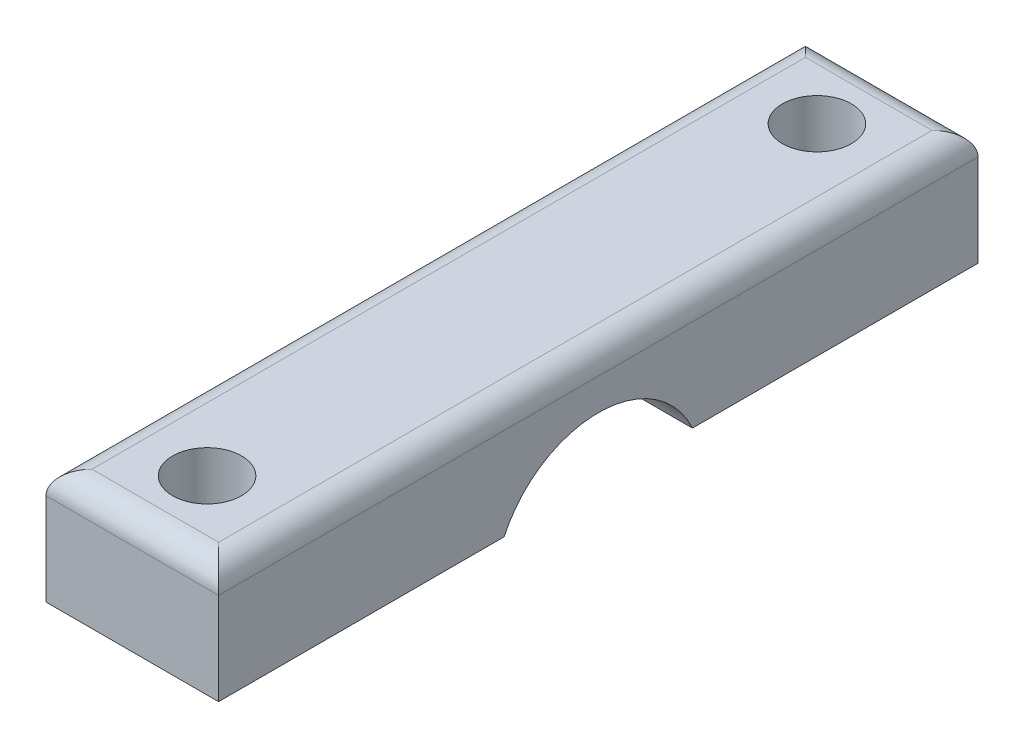
ISO-10303-21;
HEADER;
FILE_DESCRIPTION(('STEP AP214'),'2;1');
FILE_NAME('part.step','',(''),(''),'','','');
FILE_SCHEMA(('AUTOMOTIVE_DESIGN { 1 0 10303 214 1 1 1 1 }'));
ENDSEC;
DATA;
#1=APPLICATION_CONTEXT('core data for automotive mechanical design processes');
#2=APPLICATION_PROTOCOL_DEFINITION('international standard','automotive_design',2000,#1);
#3=PRODUCT_CONTEXT('',#1,'mechanical');
#4=PRODUCT('Part','Part','',(#3));
#5=PRODUCT_RELATED_PRODUCT_CATEGORY('part','',(#4));
#6=PRODUCT_DEFINITION_FORMATION('','',#4);
#7=PRODUCT_DEFINITION_CONTEXT('part definition',#1,'design');
#8=PRODUCT_DEFINITION('design','',#6,#7);
#9=PRODUCT_DEFINITION_SHAPE('','',#8);
#10=(LENGTH_UNIT() NAMED_UNIT(*) SI_UNIT(.MILLI.,.METRE.));
#11=(NAMED_UNIT(*) PLANE_ANGLE_UNIT() SI_UNIT($,.RADIAN.));
#12=(NAMED_UNIT(*) SI_UNIT($,.STERADIAN.) SOLID_ANGLE_UNIT());
#13=UNCERTAINTY_MEASURE_WITH_UNIT(LENGTH_MEASURE(1.E-05),#10,'distance_accuracy_value','');
#14=(GEOMETRIC_REPRESENTATION_CONTEXT(3) GLOBAL_UNCERTAINTY_ASSIGNED_CONTEXT((#13)) GLOBAL_UNIT_ASSIGNED_CONTEXT((#10,
#11,#12)) REPRESENTATION_CONTEXT('',''));
#15=CARTESIAN_POINT('',(0.,0.,0.));
#16=DIRECTION('',(0.,0.,1.));
#17=DIRECTION('',(1.,0.,0.));
#18=AXIS2_PLACEMENT_3D('',#15,#16,#17);
#19=CARTESIAN_POINT('',(0.,0.,0.));
#20=DIRECTION('',(0.,-1.,0.));
#21=DIRECTION('',(0.,0.,-1.));
#22=AXIS2_PLACEMENT_3D('',#19,#20,#21);
#23=PLANE('',#22);
#24=DIRECTION('',(1.,0.,0.));
#25=VECTOR('',#24,1.);
#26=CARTESIAN_POINT('',(0.,0.,-41.1815340859768));
#27=LINE('',#26,#25);
#28=CARTESIAN_POINT('',(0.,0.,-41.1815340859768));
#29=VERTEX_POINT('',#28);
#30=CARTESIAN_POINT('',(15.,0.,-41.1815340859768));
#31=VERTEX_POINT('',#30);
#32=EDGE_CURVE('E55',#29,#31,#27,.T.);
#33=ORIENTED_EDGE('',*,*,#32,.F.);
#34=DIRECTION('',(0.,0.,1.));
#35=VECTOR('',#34,1.);
#36=CARTESIAN_POINT('',(0.,0.,0.));
#37=LINE('',#36,#35);
#38=CARTESIAN_POINT('',(0.,0.,-66.));
#39=VERTEX_POINT('',#38);
#40=EDGE_CURVE('E116',#39,#29,#37,.T.);
#41=ORIENTED_EDGE('',*,*,#40,.F.);
#42=DIRECTION('',(-1.,0.,0.));
#43=VECTOR('',#42,1.);
#44=CARTESIAN_POINT('',(0.,0.,-66.));
#45=LINE('',#44,#43);
#46=CARTESIAN_POINT('',(15.,0.,-66.));
#47=VERTEX_POINT('',#46);
#48=EDGE_CURVE('E136',#47,#39,#45,.T.);
#49=ORIENTED_EDGE('',*,*,#48,.F.);
#50=DIRECTION('',(0.,0.,-1.));
#51=VECTOR('',#50,1.);
#52=CARTESIAN_POINT('',(15.,0.,0.));
#53=LINE('',#52,#51);
#54=EDGE_CURVE('E117',#31,#47,#53,.T.);
#55=ORIENTED_EDGE('',*,*,#54,.F.);
#56=EDGE_LOOP('',(#33,#41,#49,#55));
#57=FACE_BOUND('',#56,.T.);
#58=CARTESIAN_POINT('',(7.5,0.,-59.5));
#59=DIRECTION('',(0.,1.,0.));
#60=DIRECTION('',(0.,0.,1.));
#61=AXIS2_PLACEMENT_3D('',#58,#59,#60);
#62=CIRCLE('',#61,1.75);
#63=CARTESIAN_POINT('',(7.5,0.,-57.75));
#64=VERTEX_POINT('',#63);
#65=EDGE_CURVE('E129',#64,#64,#62,.T.);
#66=ORIENTED_EDGE('',*,*,#65,.T.);
#67=EDGE_LOOP('',(#66));
#68=FACE_BOUND('',#67,.T.);
#69=ADVANCED_FACE('F38',(#57,#68),#23,.T.);
#70=CARTESIAN_POINT('',(7.5,10.,-59.5));
#71=DIRECTION('',(0.,-1.,0.));
#72=DIRECTION('',(0.,0.,-1.));
#73=AXIS2_PLACEMENT_3D('',#70,#71,#72);
#74=CYLINDRICAL_SURFACE('',#73,1.75);
#75=ORIENTED_EDGE('',*,*,#65,.F.);
#76=EDGE_LOOP('',(#75));
#77=FACE_BOUND('',#76,.T.);
#78=CARTESIAN_POINT('',(7.5,4.,-59.5));
#79=DIRECTION('',(0.,1.,0.));
#80=DIRECTION('',(0.,0.,1.));
#81=AXIS2_PLACEMENT_3D('',#78,#79,#80);
#82=CIRCLE('',#81,1.75);
#83=CARTESIAN_POINT('',(7.5,4.,-57.75));
#84=VERTEX_POINT('',#83);
#85=EDGE_CURVE('E151',#84,#84,#82,.T.);
#86=ORIENTED_EDGE('',*,*,#85,.T.);
#87=EDGE_LOOP('',(#86));
#88=FACE_BOUND('',#87,.T.);
#89=ADVANCED_FACE('F198',(#77,#88),#74,.F.);
#90=CARTESIAN_POINT('',(7.5,10.,-6.5));
#91=DIRECTION('',(0.,-1.,0.));
#92=DIRECTION('',(0.,0.,-1.));
#93=AXIS2_PLACEMENT_3D('',#90,#91,#92);
#94=CYLINDRICAL_SURFACE('',#93,1.75);
#95=CARTESIAN_POINT('',(7.5,0.,-6.5));
#96=DIRECTION('',(0.,1.,0.));
#97=DIRECTION('',(0.,0.,1.));
#98=AXIS2_PLACEMENT_3D('',#95,#96,#97);
#99=CIRCLE('',#98,1.75);
#100=CARTESIAN_POINT('',(7.5,0.,-4.75));
#101=VERTEX_POINT('',#100);
#102=EDGE_CURVE('E155',#101,#101,#99,.T.);
#103=ORIENTED_EDGE('',*,*,#102,.F.);
#104=EDGE_LOOP('',(#103));
#105=FACE_BOUND('',#104,.T.);
#106=CARTESIAN_POINT('',(7.5,4.,-6.5));
#107=DIRECTION('',(0.,1.,0.));
#108=DIRECTION('',(0.,0.,1.));
#109=AXIS2_PLACEMENT_3D('',#106,#107,#108);
#110=CIRCLE('',#109,1.75);
#111=CARTESIAN_POINT('',(7.5,4.,-4.75));
#112=VERTEX_POINT('',#111);
#113=EDGE_CURVE('E148',#112,#112,#110,.T.);
#114=ORIENTED_EDGE('',*,*,#113,.T.);
#115=EDGE_LOOP('',(#114));
#116=FACE_BOUND('',#115,.T.);
#117=ADVANCED_FACE('F201',(#105,#116),#94,.F.);
#118=CARTESIAN_POINT('',(0.,10.,0.));
#119=DIRECTION('',(0.,-1.,0.));
#120=DIRECTION('',(0.,0.,-1.));
#121=AXIS2_PLACEMENT_3D('',#118,#119,#120);
#122=PLANE('',#121);
#123=DIRECTION('',(0.,0.,-1.));
#124=VECTOR('',#123,1.);
#125=CARTESIAN_POINT('',(13.,10.,0.));
#126=LINE('',#125,#124);
#127=CARTESIAN_POINT('',(13.,10.,-2.));
#128=VERTEX_POINT('',#127);
#129=CARTESIAN_POINT('',(13.,10.,-64.));
#130=VERTEX_POINT('',#129);
#131=EDGE_CURVE('E147',#128,#130,#126,.T.);
#132=ORIENTED_EDGE('',*,*,#131,.T.);
#133=DIRECTION('',(-1.,0.,0.));
#134=VECTOR('',#133,1.);
#135=CARTESIAN_POINT('',(0.,10.,-64.));
#136=LINE('',#135,#134);
#137=CARTESIAN_POINT('',(2.,10.,-64.));
#138=VERTEX_POINT('',#137);
#139=EDGE_CURVE('E161',#130,#138,#136,.T.);
#140=ORIENTED_EDGE('',*,*,#139,.T.);
#141=DIRECTION('',(0.,0.,1.));
#142=VECTOR('',#141,1.);
#143=CARTESIAN_POINT('',(2.,10.,0.));
#144=LINE('',#143,#142);
#145=CARTESIAN_POINT('',(2.,10.,-2.));
#146=VERTEX_POINT('',#145);
#147=EDGE_CURVE('E159',#138,#146,#144,.T.);
#148=ORIENTED_EDGE('',*,*,#147,.T.);
#149=DIRECTION('',(1.,0.,0.));
#150=VECTOR('',#149,1.);
#151=CARTESIAN_POINT('',(0.,10.,-2.));
#152=LINE('',#151,#150);
#153=EDGE_CURVE('E157',#146,#128,#152,.T.);
#154=ORIENTED_EDGE('',*,*,#153,.T.);
#155=EDGE_LOOP('',(#132,#140,#148,#154));
#156=FACE_BOUND('',#155,.T.);
#157=CARTESIAN_POINT('',(7.5,10.,-59.5));
#158=DIRECTION('',(0.,1.,0.));
#159=DIRECTION('',(0.,0.,1.));
#160=AXIS2_PLACEMENT_3D('',#157,#158,#159);
#161=CIRCLE('',#160,3.);
#162=CARTESIAN_POINT('',(7.5,10.,-56.5));
#163=VERTEX_POINT('',#162);
#164=EDGE_CURVE('E189',#163,#163,#161,.T.);
#165=ORIENTED_EDGE('',*,*,#164,.F.);
#166=EDGE_LOOP('',(#165));
#167=FACE_BOUND('',#166,.T.);
#168=CARTESIAN_POINT('',(7.5,10.,-6.5));
#169=DIRECTION('',(0.,1.,0.));
#170=DIRECTION('',(0.,0.,1.));
#171=AXIS2_PLACEMENT_3D('',#168,#169,#170);
#172=CIRCLE('',#171,3.);
#173=CARTESIAN_POINT('',(7.5,10.,-3.5));
#174=VERTEX_POINT('',#173);
#175=EDGE_CURVE('E179',#174,#174,#172,.T.);
#176=ORIENTED_EDGE('',*,*,#175,.F.);
#177=EDGE_LOOP('',(#176));
#178=FACE_BOUND('',#177,.T.);
#179=ADVANCED_FACE('F256',(#156,#167,#178),#122,.F.);
#180=DIRECTION('',(1.,0.,0.));
#181=VECTOR('',#180,1.);
#182=CARTESIAN_POINT('',(0.,0.,-24.8184659140232));
#183=LINE('',#182,#181);
#184=CARTESIAN_POINT('',(15.,0.,-24.8184659140232));
#185=VERTEX_POINT('',#184);
#186=CARTESIAN_POINT('',(0.,0.,-24.8184659140232));
#187=VERTEX_POINT('',#186);
#188=EDGE_CURVE('E105',#185,#187,#183,.F.);
#189=ORIENTED_EDGE('',*,*,#188,.F.);
#190=CARTESIAN_POINT('',(15.,0.,0.));
#191=VERTEX_POINT('',#190);
#192=EDGE_CURVE('E133',#191,#185,#53,.T.);
#193=ORIENTED_EDGE('',*,*,#192,.F.);
#194=DIRECTION('',(1.,0.,0.));
#195=VECTOR('',#194,1.);
#196=CARTESIAN_POINT('',(0.,0.,0.));
#197=LINE('',#196,#195);
#198=CARTESIAN_POINT('',(0.,0.,0.));
#199=VERTEX_POINT('',#198);
#200=EDGE_CURVE('E124',#199,#191,#197,.T.);
#201=ORIENTED_EDGE('',*,*,#200,.F.);
#202=EDGE_CURVE('E125',#187,#199,#37,.T.);
#203=ORIENTED_EDGE('',*,*,#202,.F.);
#204=EDGE_LOOP('',(#189,#193,#201,#203));
#205=FACE_BOUND('',#204,.T.);
#206=ORIENTED_EDGE('',*,*,#102,.T.);
#207=EDGE_LOOP('',(#206));
#208=FACE_BOUND('',#207,.T.);
#209=ADVANCED_FACE('F219',(#205,#208),#23,.T.);
#210=CARTESIAN_POINT('',(0.,10.,0.));
#211=DIRECTION('',(1.,0.,0.));
#212=DIRECTION('',(0.,0.,-1.));
#213=AXIS2_PLACEMENT_3D('',#210,#211,#212);
#214=PLANE('',#213);
#215=ORIENTED_EDGE('',*,*,#40,.T.);
#216=CARTESIAN_POINT('',(0.,-3.75,-33.));
#217=DIRECTION('',(1.,0.,0.));
#218=DIRECTION('',(0.,0.,-1.));
#219=AXIS2_PLACEMENT_3D('',#216,#217,#218);
#220=CIRCLE('',#219,9.);
#221=EDGE_CURVE('E102',#29,#187,#220,.T.);
#222=ORIENTED_EDGE('',*,*,#221,.T.);
#223=ORIENTED_EDGE('',*,*,#202,.T.);
#224=DIRECTION('',(0.,-1.,0.));
#225=VECTOR('',#224,1.);
#226=CARTESIAN_POINT('',(0.,10.,0.));
#227=LINE('',#226,#225);
#228=CARTESIAN_POINT('',(0.,8.,0.));
#229=VERTEX_POINT('',#228);
#230=EDGE_CURVE('E144',#229,#199,#227,.T.);
#231=ORIENTED_EDGE('',*,*,#230,.F.);
#232=DIRECTION('',(0.,0.,1.));
#233=VECTOR('',#232,1.);
#234=CARTESIAN_POINT('',(0.,8.,0.));
#235=LINE('',#234,#233);
#236=CARTESIAN_POINT('',(0.,8.,-66.));
#237=VERTEX_POINT('',#236);
#238=EDGE_CURVE('E167',#229,#237,#235,.F.);
#239=ORIENTED_EDGE('',*,*,#238,.T.);
#240=DIRECTION('',(0.,-1.,0.));
#241=VECTOR('',#240,1.);
#242=CARTESIAN_POINT('',(0.,10.,-66.));
#243=LINE('',#242,#241);
#244=EDGE_CURVE('E122',#237,#39,#243,.T.);
#245=ORIENTED_EDGE('',*,*,#244,.T.);
#246=EDGE_LOOP('',(#215,#222,#223,#231,#239,#245));
#247=FACE_BOUND('',#246,.T.);
#248=ADVANCED_FACE('F120',(#247),#214,.F.);
#249=CARTESIAN_POINT('',(0.,10.,0.));
#250=DIRECTION('',(0.,0.,-1.));
#251=DIRECTION('',(-1.,0.,0.));
#252=AXIS2_PLACEMENT_3D('',#249,#250,#251);
#253=PLANE('',#252);
#254=DIRECTION('',(0.,-1.,0.));
#255=VECTOR('',#254,1.);
#256=CARTESIAN_POINT('',(15.,10.,0.));
#257=LINE('',#256,#255);
#258=CARTESIAN_POINT('',(15.,8.,0.));
#259=VERTEX_POINT('',#258);
#260=EDGE_CURVE('E142',#259,#191,#257,.T.);
#261=ORIENTED_EDGE('',*,*,#260,.F.);
#262=DIRECTION('',(1.,0.,0.));
#263=VECTOR('',#262,1.);
#264=CARTESIAN_POINT('',(0.,8.,0.));
#265=LINE('',#264,#263);
#266=EDGE_CURVE('E47',#259,#229,#265,.F.);
#267=ORIENTED_EDGE('',*,*,#266,.T.);
#268=ORIENTED_EDGE('',*,*,#230,.T.);
#269=ORIENTED_EDGE('',*,*,#200,.T.);
#270=EDGE_LOOP('',(#261,#267,#268,#269));
#271=FACE_BOUND('',#270,.T.);
#272=ADVANCED_FACE('F224',(#271),#253,.F.);
#273=CARTESIAN_POINT('',(15.,10.,0.));
#274=DIRECTION('',(-1.,0.,0.));
#275=DIRECTION('',(0.,0.,1.));
#276=AXIS2_PLACEMENT_3D('',#273,#274,#275);
#277=PLANE('',#276);
#278=ORIENTED_EDGE('',*,*,#192,.T.);
#279=CARTESIAN_POINT('',(15.,-3.75,-33.));
#280=DIRECTION('',(1.,0.,0.));
#281=DIRECTION('',(0.,0.,-1.));
#282=AXIS2_PLACEMENT_3D('',#279,#280,#281);
#283=CIRCLE('',#282,9.);
#284=EDGE_CURVE('E109',#31,#185,#283,.T.);
#285=ORIENTED_EDGE('',*,*,#284,.F.);
#286=ORIENTED_EDGE('',*,*,#54,.T.);
#287=DIRECTION('',(0.,-1.,0.));
#288=VECTOR('',#287,1.);
#289=CARTESIAN_POINT('',(15.,10.,-66.));
#290=LINE('',#289,#288);
#291=CARTESIAN_POINT('',(15.,8.,-66.));
#292=VERTEX_POINT('',#291);
#293=EDGE_CURVE('E139',#292,#47,#290,.T.);
#294=ORIENTED_EDGE('',*,*,#293,.F.);
#295=DIRECTION('',(0.,0.,-1.));
#296=VECTOR('',#295,1.);
#297=CARTESIAN_POINT('',(15.,8.,0.));
#298=LINE('',#297,#296);
#299=EDGE_CURVE('E11',#292,#259,#298,.F.);
#300=ORIENTED_EDGE('',*,*,#299,.T.);
#301=ORIENTED_EDGE('',*,*,#260,.T.);
#302=EDGE_LOOP('',(#278,#285,#286,#294,#300,#301));
#303=FACE_BOUND('',#302,.T.);
#304=ADVANCED_FACE('F221',(#303),#277,.F.);
#305=CARTESIAN_POINT('',(0.,10.,-66.));
#306=DIRECTION('',(0.,0.,1.));
#307=DIRECTION('',(1.,0.,0.));
#308=AXIS2_PLACEMENT_3D('',#305,#306,#307);
#309=PLANE('',#308);
#310=ORIENTED_EDGE('',*,*,#244,.F.);
#311=DIRECTION('',(-1.,0.,0.));
#312=VECTOR('',#311,1.);
#313=CARTESIAN_POINT('',(0.,8.,-66.));
#314=LINE('',#313,#312);
#315=EDGE_CURVE('E164',#237,#292,#314,.F.);
#316=ORIENTED_EDGE('',*,*,#315,.T.);
#317=ORIENTED_EDGE('',*,*,#293,.T.);
#318=ORIENTED_EDGE('',*,*,#48,.T.);
#319=EDGE_LOOP('',(#310,#316,#317,#318));
#320=FACE_BOUND('',#319,.T.);
#321=ADVANCED_FACE('F236',(#320),#309,.F.);
#322=CARTESIAN_POINT('',(7.5,4.,-6.5));
#323=DIRECTION('',(0.,1.,0.));
#324=DIRECTION('',(0.,0.,1.));
#325=AXIS2_PLACEMENT_3D('',#322,#323,#324);
#326=CYLINDRICAL_SURFACE('',#325,3.);
#327=CARTESIAN_POINT('',(7.5,4.,-6.5));
#328=DIRECTION('',(0.,1.,0.));
#329=DIRECTION('',(0.,0.,1.));
#330=AXIS2_PLACEMENT_3D('',#327,#328,#329);
#331=CIRCLE('',#330,3.);
#332=CARTESIAN_POINT('',(7.5,4.,-3.5));
#333=VERTEX_POINT('',#332);
#334=EDGE_CURVE('E184',#333,#333,#331,.T.);
#335=ORIENTED_EDGE('',*,*,#334,.F.);
#336=EDGE_LOOP('',(#335));
#337=FACE_BOUND('',#336,.T.);
#338=ORIENTED_EDGE('',*,*,#175,.T.);
#339=EDGE_LOOP('',(#338));
#340=FACE_BOUND('',#339,.T.);
#341=ADVANCED_FACE('F238',(#337,#340),#326,.F.);
#342=CARTESIAN_POINT('',(7.5,4.,-6.5));
#343=DIRECTION('',(0.,1.,0.));
#344=DIRECTION('',(0.,0.,1.));
#345=AXIS2_PLACEMENT_3D('',#342,#343,#344);
#346=PLANE('',#345);
#347=ORIENTED_EDGE('',*,*,#113,.F.);
#348=EDGE_LOOP('',(#347));
#349=FACE_BOUND('',#348,.T.);
#350=ORIENTED_EDGE('',*,*,#334,.T.);
#351=EDGE_LOOP('',(#350));
#352=FACE_BOUND('',#351,.T.);
#353=ADVANCED_FACE('F244',(#349,#352),#346,.T.);
#354=CARTESIAN_POINT('',(7.5,4.,-59.5));
#355=DIRECTION('',(0.,1.,0.));
#356=DIRECTION('',(0.,0.,1.));
#357=AXIS2_PLACEMENT_3D('',#354,#355,#356);
#358=CYLINDRICAL_SURFACE('',#357,3.);
#359=CARTESIAN_POINT('',(7.5,4.,-59.5));
#360=DIRECTION('',(0.,1.,0.));
#361=DIRECTION('',(0.,0.,1.));
#362=AXIS2_PLACEMENT_3D('',#359,#360,#361);
#363=CIRCLE('',#362,3.);
#364=CARTESIAN_POINT('',(7.5,4.,-56.5));
#365=VERTEX_POINT('',#364);
#366=EDGE_CURVE('E152',#365,#365,#363,.T.);
#367=ORIENTED_EDGE('',*,*,#366,.F.);
#368=EDGE_LOOP('',(#367));
#369=FACE_BOUND('',#368,.T.);
#370=ORIENTED_EDGE('',*,*,#164,.T.);
#371=EDGE_LOOP('',(#370));
#372=FACE_BOUND('',#371,.T.);
#373=ADVANCED_FACE('F208',(#369,#372),#358,.F.);
#374=CARTESIAN_POINT('',(7.5,4.,-59.5));
#375=DIRECTION('',(0.,1.,0.));
#376=DIRECTION('',(0.,0.,1.));
#377=AXIS2_PLACEMENT_3D('',#374,#375,#376);
#378=PLANE('',#377);
#379=ORIENTED_EDGE('',*,*,#85,.F.);
#380=EDGE_LOOP('',(#379));
#381=FACE_BOUND('',#380,.T.);
#382=ORIENTED_EDGE('',*,*,#366,.T.);
#383=EDGE_LOOP('',(#382));
#384=FACE_BOUND('',#383,.T.);
#385=ADVANCED_FACE('F205',(#381,#384),#378,.T.);
#386=CARTESIAN_POINT('',(0.,8.,-2.));
#387=DIRECTION('',(1.,0.,0.));
#388=DIRECTION('',(0.,0.,-1.));
#389=AXIS2_PLACEMENT_3D('',#386,#387,#388);
#390=CYLINDRICAL_SURFACE('',#389,2.);
#391=CARTESIAN_POINT('',(2.,8.,-2.));
#392=DIRECTION('',(0.707106781186547,0.,0.707106781186547));
#393=DIRECTION('',(0.707106781186547,0.,-0.707106781186547));
#394=AXIS2_PLACEMENT_3D('',#391,#392,#393);
#395=ELLIPSE('',#394,2.82842712474619,2.);
#396=EDGE_CURVE('E172',#229,#146,#395,.F.);
#397=ORIENTED_EDGE('',*,*,#396,.F.);
#398=ORIENTED_EDGE('',*,*,#266,.F.);
#399=CARTESIAN_POINT('',(13.,8.,-2.));
#400=DIRECTION('',(0.707106781186547,0.,-0.707106781186547));
#401=DIRECTION('',(-0.707106781186547,0.,-0.707106781186547));
#402=AXIS2_PLACEMENT_3D('',#399,#400,#401);
#403=ELLIPSE('',#402,2.82842712474619,2.);
#404=EDGE_CURVE('E42',#128,#259,#403,.T.);
#405=ORIENTED_EDGE('',*,*,#404,.F.);
#406=ORIENTED_EDGE('',*,*,#153,.F.);
#407=EDGE_LOOP('',(#397,#398,#405,#406));
#408=FACE_BOUND('',#407,.T.);
#409=ADVANCED_FACE('F40',(#408),#390,.T.);
#410=CARTESIAN_POINT('',(13.,8.,0.));
#411=DIRECTION('',(0.,0.,-1.));
#412=DIRECTION('',(-1.,0.,0.));
#413=AXIS2_PLACEMENT_3D('',#410,#411,#412);
#414=CYLINDRICAL_SURFACE('',#413,2.);
#415=ORIENTED_EDGE('',*,*,#404,.T.);
#416=ORIENTED_EDGE('',*,*,#299,.F.);
#417=CARTESIAN_POINT('',(13.,8.,-64.));
#418=DIRECTION('',(-0.707106781186547,0.,-0.707106781186547));
#419=DIRECTION('',(0.707106781186547,0.,-0.707106781186547));
#420=AXIS2_PLACEMENT_3D('',#417,#418,#419);
#421=ELLIPSE('',#420,2.82842712474619,2.);
#422=EDGE_CURVE('E171',#130,#292,#421,.T.);
#423=ORIENTED_EDGE('',*,*,#422,.F.);
#424=ORIENTED_EDGE('',*,*,#131,.F.);
#425=EDGE_LOOP('',(#415,#416,#423,#424));
#426=FACE_BOUND('',#425,.T.);
#427=ADVANCED_FACE('F283',(#426),#414,.T.);
#428=CARTESIAN_POINT('',(2.,8.,0.));
#429=DIRECTION('',(0.,0.,1.));
#430=DIRECTION('',(1.,0.,0.));
#431=AXIS2_PLACEMENT_3D('',#428,#429,#430);
#432=CYLINDRICAL_SURFACE('',#431,2.);
#433=ORIENTED_EDGE('',*,*,#396,.T.);
#434=ORIENTED_EDGE('',*,*,#147,.F.);
#435=CARTESIAN_POINT('',(2.,8.,-64.));
#436=DIRECTION('',(-0.707106781186547,0.,0.707106781186547));
#437=DIRECTION('',(0.707106781186547,0.,0.707106781186547));
#438=AXIS2_PLACEMENT_3D('',#435,#436,#437);
#439=ELLIPSE('',#438,2.82842712474619,2.);
#440=EDGE_CURVE('E118',#237,#138,#439,.F.);
#441=ORIENTED_EDGE('',*,*,#440,.F.);
#442=ORIENTED_EDGE('',*,*,#238,.F.);
#443=EDGE_LOOP('',(#433,#434,#441,#442));
#444=FACE_BOUND('',#443,.T.);
#445=ADVANCED_FACE('F229',(#444),#432,.T.);
#446=CARTESIAN_POINT('',(0.,8.,-64.));
#447=DIRECTION('',(-1.,0.,0.));
#448=DIRECTION('',(0.,0.,1.));
#449=AXIS2_PLACEMENT_3D('',#446,#447,#448);
#450=CYLINDRICAL_SURFACE('',#449,2.);
#451=ORIENTED_EDGE('',*,*,#422,.T.);
#452=ORIENTED_EDGE('',*,*,#315,.F.);
#453=ORIENTED_EDGE('',*,*,#440,.T.);
#454=ORIENTED_EDGE('',*,*,#139,.F.);
#455=EDGE_LOOP('',(#451,#452,#453,#454));
#456=FACE_BOUND('',#455,.T.);
#457=ADVANCED_FACE('F233',(#456),#450,.T.);
#458=CARTESIAN_POINT('',(0.,-3.75,-33.));
#459=DIRECTION('',(1.,0.,0.));
#460=DIRECTION('',(0.,0.,-1.));
#461=AXIS2_PLACEMENT_3D('',#458,#459,#460);
#462=CYLINDRICAL_SURFACE('',#461,9.);
#463=ORIENTED_EDGE('',*,*,#32,.T.);
#464=ORIENTED_EDGE('',*,*,#284,.T.);
#465=ORIENTED_EDGE('',*,*,#188,.T.);
#466=ORIENTED_EDGE('',*,*,#221,.F.);
#467=EDGE_LOOP('',(#463,#464,#465,#466));
#468=FACE_BOUND('',#467,.T.);
#469=ADVANCED_FACE('F103',(#468),#462,.F.);
#470=CLOSED_SHELL('',(#69,#89,#117,#179,#209,#248,#272,#304,#321,#341,#353,#373,#385,#409,#427,
#445,#457,#469));
#471=MANIFOLD_SOLID_BREP('B2',#470);
#472=ADVANCED_BREP_SHAPE_REPRESENTATION('',(#18,#471),#14);
#473=SHAPE_DEFINITION_REPRESENTATION(#9,#472);
ENDSEC;
END-ISO-10303-21;
